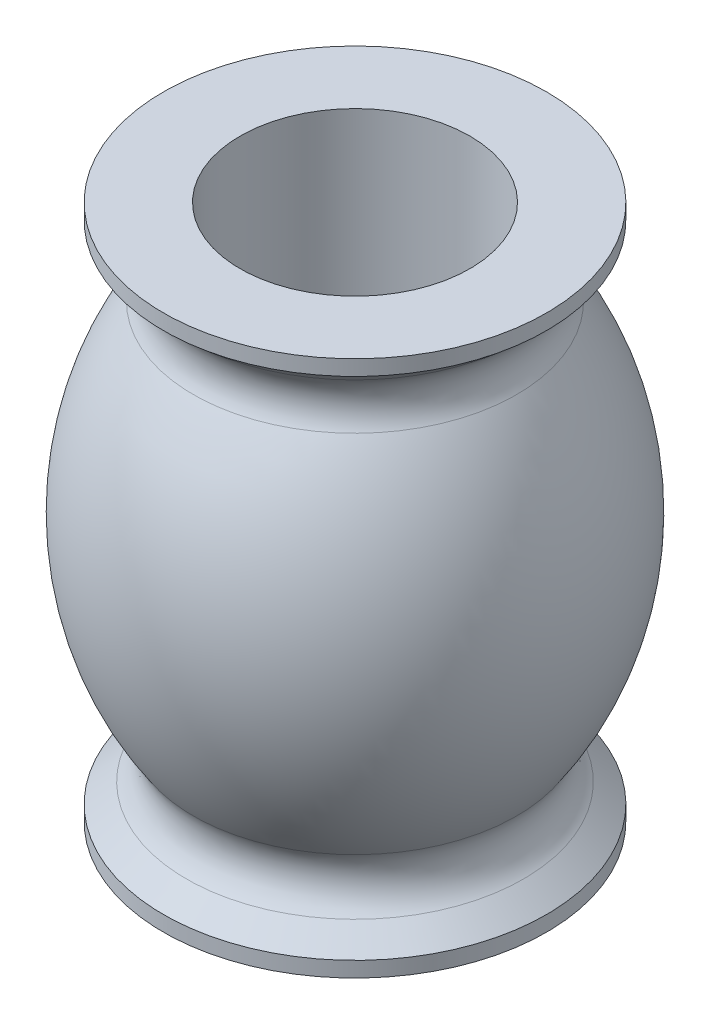
ISO-10303-21;
HEADER;
FILE_DESCRIPTION(('STEP AP214'),'2;1');
FILE_NAME('part.step','',(''),(''),'','','');
FILE_SCHEMA(('AUTOMOTIVE_DESIGN { 1 0 10303 214 1 1 1 1 }'));
ENDSEC;
DATA;
#1=APPLICATION_CONTEXT('core data for automotive mechanical design processes');
#2=APPLICATION_PROTOCOL_DEFINITION('international standard','automotive_design',2000,#1);
#3=PRODUCT_CONTEXT('',#1,'mechanical');
#4=PRODUCT('Part','Part','',(#3));
#5=PRODUCT_RELATED_PRODUCT_CATEGORY('part','',(#4));
#6=PRODUCT_DEFINITION_FORMATION('','',#4);
#7=PRODUCT_DEFINITION_CONTEXT('part definition',#1,'design');
#8=PRODUCT_DEFINITION('design','',#6,#7);
#9=PRODUCT_DEFINITION_SHAPE('','',#8);
#10=(LENGTH_UNIT() NAMED_UNIT(*) SI_UNIT(.MILLI.,.METRE.));
#11=(NAMED_UNIT(*) PLANE_ANGLE_UNIT() SI_UNIT($,.RADIAN.));
#12=(NAMED_UNIT(*) SI_UNIT($,.STERADIAN.) SOLID_ANGLE_UNIT());
#13=UNCERTAINTY_MEASURE_WITH_UNIT(LENGTH_MEASURE(1.E-05),#10,'distance_accuracy_value','');
#14=(GEOMETRIC_REPRESENTATION_CONTEXT(3) GLOBAL_UNCERTAINTY_ASSIGNED_CONTEXT((#13)) GLOBAL_UNIT_ASSIGNED_CONTEXT((#10,
#11,#12)) REPRESENTATION_CONTEXT('',''));
#15=CARTESIAN_POINT('',(0.,0.,0.));
#16=DIRECTION('',(0.,0.,1.));
#17=DIRECTION('',(1.,0.,0.));
#18=AXIS2_PLACEMENT_3D('',#15,#16,#17);
#19=CARTESIAN_POINT('',(0.,3.5,0.));
#20=DIRECTION('',(0.,-1.,0.));
#21=DIRECTION('',(0.,0.,-1.));
#22=AXIS2_PLACEMENT_3D('',#19,#20,#21);
#23=CYLINDRICAL_SURFACE('',#22,2.50000000005457);
#24=CARTESIAN_POINT('',(0.,3.5,0.));
#25=DIRECTION('',(0.,-1.,0.));
#26=DIRECTION('',(0.,0.,-1.));
#27=AXIS2_PLACEMENT_3D('',#24,#25,#26);
#28=CIRCLE('',#27,2.50000000005457);
#29=CARTESIAN_POINT('',(0.,3.5,-2.50000000005457));
#30=VERTEX_POINT('',#29);
#31=EDGE_CURVE('E67',#30,#30,#28,.T.);
#32=ORIENTED_EDGE('',*,*,#31,.T.);
#33=EDGE_LOOP('',(#32));
#34=FACE_BOUND('',#33,.T.);
#35=CARTESIAN_POINT('',(0.,3.30000000000599,0.));
#36=DIRECTION('',(0.,-1.,0.));
#37=DIRECTION('',(0.,0.,-1.));
#38=AXIS2_PLACEMENT_3D('',#35,#36,#37);
#39=CIRCLE('',#38,2.50000000005457);
#40=CARTESIAN_POINT('',(0.,3.30000000000599,-2.50000000005457));
#41=VERTEX_POINT('',#40);
#42=EDGE_CURVE('E10',#41,#41,#39,.T.);
#43=ORIENTED_EDGE('',*,*,#42,.F.);
#44=EDGE_LOOP('',(#43));
#45=FACE_BOUND('',#44,.T.);
#46=ADVANCED_FACE('F33',(#34,#45),#23,.T.);
#47=CARTESIAN_POINT('',(0.,3.048185186871,0.));
#48=DIRECTION('',(0.,1.,0.));
#49=DIRECTION('',(0.,0.,1.));
#50=AXIS2_PLACEMENT_3D('',#47,#48,#49);
#51=CONICAL_SURFACE('',#50,2.19989879178413,0.872664626076531);
#52=ORIENTED_EDGE('',*,*,#42,.T.);
#53=EDGE_LOOP('',(#52));
#54=FACE_BOUND('',#53,.T.);
#55=CARTESIAN_POINT('',(0.,3.048185186871,0.));
#56=DIRECTION('',(0.,-1.,0.));
#57=DIRECTION('',(0.,0.,-1.));
#58=AXIS2_PLACEMENT_3D('',#55,#56,#57);
#59=CIRCLE('',#58,2.19989879178413);
#60=CARTESIAN_POINT('',(0.,3.048185186871,-2.19989879178413));
#61=VERTEX_POINT('',#60);
#62=EDGE_CURVE('E39',#61,#61,#59,.T.);
#63=ORIENTED_EDGE('',*,*,#62,.F.);
#64=EDGE_LOOP('',(#63));
#65=FACE_BOUND('',#64,.T.);
#66=ADVANCED_FACE('F85',(#54,#65),#51,.T.);
#67=CARTESIAN_POINT('',(0.,2.66516296526923,0.));
#68=DIRECTION('',(0.,-1.,0.));
#69=DIRECTION('',(0.,0.,-1.));
#70=AXIS2_PLACEMENT_3D('',#67,#68,#69);
#71=TOROIDAL_SURFACE('',#70,2.52129259661107,0.500000000021889);
#72=ORIENTED_EDGE('',*,*,#62,.T.);
#73=EDGE_LOOP('',(#72));
#74=FACE_BOUND('',#73,.T.);
#75=CARTESIAN_POINT('',(0.,2.38163499022326,0.));
#76=DIRECTION('',(0.,-1.,0.));
#77=DIRECTION('',(0.,0.,-1.));
#78=AXIS2_PLACEMENT_3D('',#75,#76,#77);
#79=CIRCLE('',#78,2.10945295865933);
#80=CARTESIAN_POINT('',(0.,2.38163499022326,-2.10945295865933));
#81=VERTEX_POINT('',#80);
#82=EDGE_CURVE('E43',#81,#81,#79,.T.);
#83=ORIENTED_EDGE('',*,*,#82,.F.);
#84=EDGE_LOOP('',(#83));
#85=FACE_BOUND('',#84,.T.);
#86=ADVANCED_FACE('F89',(#74,#85),#71,.F.);
#87=CARTESIAN_POINT('',(0.,-5.8975244140788E-11,0.));
#88=DIRECTION('',(0.,-1.,0.));
#89=DIRECTION('',(0.,0.,-1.));
#90=AXIS2_PLACEMENT_3D('',#87,#88,#89);
#91=DEGENERATE_TOROIDAL_SURFACE('',#90,1.34999999998439,4.20000000000064,.F.);
#92=ORIENTED_EDGE('',*,*,#82,.T.);
#93=EDGE_LOOP('',(#92));
#94=FACE_BOUND('',#93,.T.);
#95=CARTESIAN_POINT('',(0.,-2.38163499026222,0.));
#96=DIRECTION('',(0.,-1.,0.));
#97=DIRECTION('',(0.,0.,-1.));
#98=AXIS2_PLACEMENT_3D('',#95,#96,#97);
#99=CIRCLE('',#98,2.10945295871371);
#100=CARTESIAN_POINT('',(0.,-2.38163499026222,-2.10945295871371));
#101=VERTEX_POINT('',#100);
#102=EDGE_CURVE('E47',#101,#101,#99,.T.);
#103=ORIENTED_EDGE('',*,*,#102,.F.);
#104=EDGE_LOOP('',(#103));
#105=FACE_BOUND('',#104,.T.);
#106=ADVANCED_FACE('F93',(#94,#105),#91,.F.);
#107=CARTESIAN_POINT('',(0.,-2.66516296528622,0.));
#108=DIRECTION('',(0.,-1.,0.));
#109=DIRECTION('',(0.,0.,-1.));
#110=AXIS2_PLACEMENT_3D('',#107,#108,#109);
#111=TOROIDAL_SURFACE('',#110,2.52129259665366,0.499999999999718);
#112=ORIENTED_EDGE('',*,*,#102,.T.);
#113=EDGE_LOOP('',(#112));
#114=FACE_BOUND('',#113,.T.);
#115=CARTESIAN_POINT('',(0.,-3.04818518681104,0.));
#116=DIRECTION('',(0.,-1.,0.));
#117=DIRECTION('',(0.,0.,-1.));
#118=AXIS2_PLACEMENT_3D('',#115,#116,#117);
#119=CIRCLE('',#118,2.19989879176953);
#120=CARTESIAN_POINT('',(0.,-3.04818518681104,-2.19989879176953));
#121=VERTEX_POINT('',#120);
#122=EDGE_CURVE('E52',#121,#121,#119,.T.);
#123=ORIENTED_EDGE('',*,*,#122,.F.);
#124=EDGE_LOOP('',(#123));
#125=FACE_BOUND('',#124,.T.);
#126=ADVANCED_FACE('F99',(#114,#125),#111,.F.);
#127=CARTESIAN_POINT('',(0.,-3.30000000005369,0.));
#128=DIRECTION('',(0.,-1.,0.));
#129=DIRECTION('',(0.,0.,-1.));
#130=AXIS2_PLACEMENT_3D('',#127,#128,#129);
#131=CONICAL_SURFACE('',#130,2.50000000005457,0.872664625889992);
#132=ORIENTED_EDGE('',*,*,#122,.T.);
#133=EDGE_LOOP('',(#132));
#134=FACE_BOUND('',#133,.T.);
#135=CARTESIAN_POINT('',(0.,-3.30000000005369,0.));
#136=DIRECTION('',(0.,-1.,0.));
#137=DIRECTION('',(0.,0.,-1.));
#138=AXIS2_PLACEMENT_3D('',#135,#136,#137);
#139=CIRCLE('',#138,2.50000000005457);
#140=CARTESIAN_POINT('',(0.,-3.30000000005369,-2.50000000005457));
#141=VERTEX_POINT('',#140);
#142=EDGE_CURVE('E55',#141,#141,#139,.T.);
#143=ORIENTED_EDGE('',*,*,#142,.F.);
#144=EDGE_LOOP('',(#143));
#145=FACE_BOUND('',#144,.T.);
#146=ADVANCED_FACE('F103',(#134,#145),#131,.T.);
#147=CARTESIAN_POINT('',(0.,3.5,0.));
#148=DIRECTION('',(0.,-1.,0.));
#149=DIRECTION('',(0.,0.,-1.));
#150=AXIS2_PLACEMENT_3D('',#147,#148,#149);
#151=CYLINDRICAL_SURFACE('',#150,2.50000000005457);
#152=ORIENTED_EDGE('',*,*,#142,.T.);
#153=EDGE_LOOP('',(#152));
#154=FACE_BOUND('',#153,.T.);
#155=CARTESIAN_POINT('',(0.,-3.5,0.));
#156=DIRECTION('',(0.,-1.,0.));
#157=DIRECTION('',(0.,0.,-1.));
#158=AXIS2_PLACEMENT_3D('',#155,#156,#157);
#159=CIRCLE('',#158,2.50000000005457);
#160=CARTESIAN_POINT('',(0.,-3.5,-2.50000000005457));
#161=VERTEX_POINT('',#160);
#162=EDGE_CURVE('E58',#161,#161,#159,.T.);
#163=ORIENTED_EDGE('',*,*,#162,.F.);
#164=EDGE_LOOP('',(#163));
#165=FACE_BOUND('',#164,.T.);
#166=ADVANCED_FACE('F107',(#154,#165),#151,.T.);
#167=CARTESIAN_POINT('',(1.50000000005457,-3.5,0.));
#168=DIRECTION('',(0.,-1.,0.));
#169=DIRECTION('',(0.,0.,-1.));
#170=AXIS2_PLACEMENT_3D('',#167,#168,#169);
#171=PLANE('',#170);
#172=ORIENTED_EDGE('',*,*,#162,.T.);
#173=EDGE_LOOP('',(#172));
#174=FACE_BOUND('',#173,.T.);
#175=CARTESIAN_POINT('',(0.,-3.5,0.));
#176=DIRECTION('',(0.,-1.,0.));
#177=DIRECTION('',(0.,0.,-1.));
#178=AXIS2_PLACEMENT_3D('',#175,#176,#177);
#179=CIRCLE('',#178,1.50000000005457);
#180=CARTESIAN_POINT('',(0.,-3.5,-1.50000000005457));
#181=VERTEX_POINT('',#180);
#182=EDGE_CURVE('E61',#181,#181,#179,.T.);
#183=ORIENTED_EDGE('',*,*,#182,.F.);
#184=EDGE_LOOP('',(#183));
#185=FACE_BOUND('',#184,.T.);
#186=ADVANCED_FACE('F81',(#174,#185),#171,.T.);
#187=CARTESIAN_POINT('',(0.,3.5,0.));
#188=DIRECTION('',(0.,-1.,0.));
#189=DIRECTION('',(0.,0.,-1.));
#190=AXIS2_PLACEMENT_3D('',#187,#188,#189);
#191=CYLINDRICAL_SURFACE('',#190,1.50000000005457);
#192=ORIENTED_EDGE('',*,*,#182,.T.);
#193=EDGE_LOOP('',(#192));
#194=FACE_BOUND('',#193,.T.);
#195=CARTESIAN_POINT('',(0.,3.5,0.));
#196=DIRECTION('',(0.,-1.,0.));
#197=DIRECTION('',(0.,0.,-1.));
#198=AXIS2_PLACEMENT_3D('',#195,#196,#197);
#199=CIRCLE('',#198,1.50000000005457);
#200=CARTESIAN_POINT('',(0.,3.5,-1.50000000005457));
#201=VERTEX_POINT('',#200);
#202=EDGE_CURVE('E64',#201,#201,#199,.T.);
#203=ORIENTED_EDGE('',*,*,#202,.F.);
#204=EDGE_LOOP('',(#203));
#205=FACE_BOUND('',#204,.T.);
#206=ADVANCED_FACE('F75',(#194,#205),#191,.F.);
#207=CARTESIAN_POINT('',(2.50000000005457,3.5,0.));
#208=DIRECTION('',(0.,1.,0.));
#209=DIRECTION('',(0.,0.,1.));
#210=AXIS2_PLACEMENT_3D('',#207,#208,#209);
#211=PLANE('',#210);
#212=ORIENTED_EDGE('',*,*,#202,.T.);
#213=EDGE_LOOP('',(#212));
#214=FACE_BOUND('',#213,.T.);
#215=ORIENTED_EDGE('',*,*,#31,.F.);
#216=EDGE_LOOP('',(#215));
#217=FACE_BOUND('',#216,.T.);
#218=ADVANCED_FACE('F73',(#214,#217),#211,.T.);
#219=CLOSED_SHELL('',(#46,#66,#86,#106,#126,#146,#166,#186,#206,#218));
#220=MANIFOLD_SOLID_BREP('B2',#219);
#221=ADVANCED_BREP_SHAPE_REPRESENTATION('',(#18,#220),#14);
#222=SHAPE_DEFINITION_REPRESENTATION(#9,#221);
ENDSEC;
END-ISO-10303-21;
